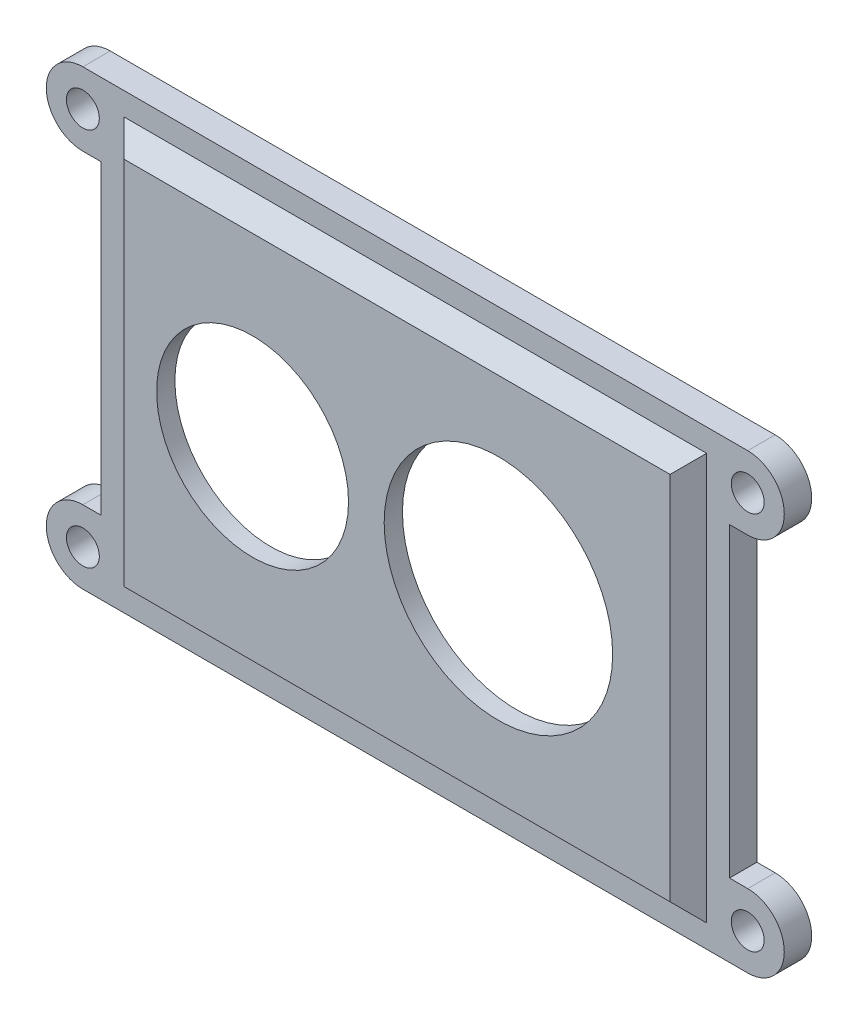
ISO-10303-21;
HEADER;
FILE_DESCRIPTION(('STEP AP214'),'2;1');
FILE_NAME('part.step','',(''),(''),'','','');
FILE_SCHEMA(('AUTOMOTIVE_DESIGN { 1 0 10303 214 1 1 1 1 }'));
ENDSEC;
DATA;
#1=APPLICATION_CONTEXT('core data for automotive mechanical design processes');
#2=APPLICATION_PROTOCOL_DEFINITION('international standard','automotive_design',2000,#1);
#3=PRODUCT_CONTEXT('',#1,'mechanical');
#4=PRODUCT('Part','Part','',(#3));
#5=PRODUCT_RELATED_PRODUCT_CATEGORY('part','',(#4));
#6=PRODUCT_DEFINITION_FORMATION('','',#4);
#7=PRODUCT_DEFINITION_CONTEXT('part definition',#1,'design');
#8=PRODUCT_DEFINITION('design','',#6,#7);
#9=PRODUCT_DEFINITION_SHAPE('','',#8);
#10=(LENGTH_UNIT() NAMED_UNIT(*) SI_UNIT(.MILLI.,.METRE.));
#11=(NAMED_UNIT(*) PLANE_ANGLE_UNIT() SI_UNIT($,.RADIAN.));
#12=(NAMED_UNIT(*) SI_UNIT($,.STERADIAN.) SOLID_ANGLE_UNIT());
#13=UNCERTAINTY_MEASURE_WITH_UNIT(LENGTH_MEASURE(1.E-05),#10,'distance_accuracy_value','');
#14=(GEOMETRIC_REPRESENTATION_CONTEXT(3) GLOBAL_UNCERTAINTY_ASSIGNED_CONTEXT((#13)) GLOBAL_UNIT_ASSIGNED_CONTEXT((#10,
#11,#12)) REPRESENTATION_CONTEXT('',''));
#15=CARTESIAN_POINT('',(0.,0.,0.));
#16=DIRECTION('',(0.,0.,1.));
#17=DIRECTION('',(1.,0.,0.));
#18=AXIS2_PLACEMENT_3D('',#15,#16,#17);
#19=CARTESIAN_POINT('',(-34.375,-24.75,5.));
#20=DIRECTION('',(1.,0.,0.));
#21=DIRECTION('',(0.,0.,-1.));
#22=AXIS2_PLACEMENT_3D('',#19,#20,#21);
#23=PLANE('',#22);
#24=DIRECTION('',(0.,0.,-1.));
#25=VECTOR('',#24,1.);
#26=CARTESIAN_POINT('',(-34.375,-16.75,3.));
#27=LINE('',#26,#25);
#28=CARTESIAN_POINT('',(-34.375,-16.75,3.));
#29=VERTEX_POINT('',#28);
#30=CARTESIAN_POINT('',(-34.375,-16.75,0.));
#31=VERTEX_POINT('',#30);
#32=EDGE_CURVE('E259',#29,#31,#27,.T.);
#33=ORIENTED_EDGE('',*,*,#32,.F.);
#34=DIRECTION('',(0.,1.,0.));
#35=VECTOR('',#34,1.);
#36=CARTESIAN_POINT('',(-34.375,0.,3.));
#37=LINE('',#36,#35);
#38=CARTESIAN_POINT('',(-34.375,16.75,3.));
#39=VERTEX_POINT('',#38);
#40=EDGE_CURVE('E217',#29,#39,#37,.T.);
#41=ORIENTED_EDGE('',*,*,#40,.T.);
#42=DIRECTION('',(0.,0.,-1.));
#43=VECTOR('',#42,1.);
#44=CARTESIAN_POINT('',(-34.375,16.75,3.));
#45=LINE('',#44,#43);
#46=CARTESIAN_POINT('',(-34.375,16.75,0.));
#47=VERTEX_POINT('',#46);
#48=EDGE_CURVE('E230',#39,#47,#45,.T.);
#49=ORIENTED_EDGE('',*,*,#48,.T.);
#50=DIRECTION('',(0.,-1.,0.));
#51=VECTOR('',#50,1.);
#52=CARTESIAN_POINT('',(-34.375,-24.75,0.));
#53=LINE('',#52,#51);
#54=EDGE_CURVE('E352',#47,#31,#53,.T.);
#55=ORIENTED_EDGE('',*,*,#54,.T.);
#56=EDGE_LOOP('',(#33,#41,#49,#55));
#57=FACE_BOUND('',#56,.T.);
#58=ADVANCED_FACE('F41',(#57),#23,.F.);
#59=CARTESIAN_POINT('',(34.375,-24.75,5.));
#60=DIRECTION('',(-1.,0.,0.));
#61=DIRECTION('',(0.,0.,1.));
#62=AXIS2_PLACEMENT_3D('',#59,#60,#61);
#63=PLANE('',#62);
#64=DIRECTION('',(0.,0.,-1.));
#65=VECTOR('',#64,1.);
#66=CARTESIAN_POINT('',(34.375,16.75,3.));
#67=LINE('',#66,#65);
#68=CARTESIAN_POINT('',(34.375,16.75,3.));
#69=VERTEX_POINT('',#68);
#70=CARTESIAN_POINT('',(34.375,16.75,0.));
#71=VERTEX_POINT('',#70);
#72=EDGE_CURVE('E328',#69,#71,#67,.T.);
#73=ORIENTED_EDGE('',*,*,#72,.F.);
#74=DIRECTION('',(0.,-1.,0.));
#75=VECTOR('',#74,1.);
#76=CARTESIAN_POINT('',(34.375,0.,3.));
#77=LINE('',#76,#75);
#78=CARTESIAN_POINT('',(34.375,-16.75,3.));
#79=VERTEX_POINT('',#78);
#80=EDGE_CURVE('E188',#69,#79,#77,.T.);
#81=ORIENTED_EDGE('',*,*,#80,.T.);
#82=DIRECTION('',(0.,0.,-1.));
#83=VECTOR('',#82,1.);
#84=CARTESIAN_POINT('',(34.375,-16.75,3.));
#85=LINE('',#84,#83);
#86=CARTESIAN_POINT('',(34.375,-16.75,0.));
#87=VERTEX_POINT('',#86);
#88=EDGE_CURVE('E220',#79,#87,#85,.T.);
#89=ORIENTED_EDGE('',*,*,#88,.T.);
#90=DIRECTION('',(0.,1.,0.));
#91=VECTOR('',#90,1.);
#92=CARTESIAN_POINT('',(34.375,-24.75,0.));
#93=LINE('',#92,#91);
#94=EDGE_CURVE('E362',#87,#71,#93,.T.);
#95=ORIENTED_EDGE('',*,*,#94,.T.);
#96=EDGE_LOOP('',(#73,#81,#89,#95));
#97=FACE_BOUND('',#96,.T.);
#98=ADVANCED_FACE('F388',(#97),#63,.F.);
#99=CARTESIAN_POINT('',(34.375,-24.75,5.));
#100=DIRECTION('',(0.,1.,0.));
#101=DIRECTION('',(-1.,0.,0.));
#102=AXIS2_PLACEMENT_3D('',#99,#100,#101);
#103=PLANE('',#102);
#104=DIRECTION('',(-1.,0.,0.));
#105=VECTOR('',#104,1.);
#106=CARTESIAN_POINT('',(36.375,-24.75,3.));
#107=LINE('',#106,#105);
#108=CARTESIAN_POINT('',(36.375,-24.75,3.));
#109=VERTEX_POINT('',#108);
#110=CARTESIAN_POINT('',(-36.375,-24.75,3.));
#111=VERTEX_POINT('',#110);
#112=EDGE_CURVE('E298',#109,#111,#107,.T.);
#113=ORIENTED_EDGE('',*,*,#112,.T.);
#114=DIRECTION('',(0.,0.,-1.));
#115=VECTOR('',#114,1.);
#116=CARTESIAN_POINT('',(-36.375,-24.75,3.));
#117=LINE('',#116,#115);
#118=CARTESIAN_POINT('',(-36.375,-24.75,0.));
#119=VERTEX_POINT('',#118);
#120=EDGE_CURVE('E258',#111,#119,#117,.T.);
#121=ORIENTED_EDGE('',*,*,#120,.T.);
#122=DIRECTION('',(1.,0.,0.));
#123=VECTOR('',#122,1.);
#124=CARTESIAN_POINT('',(34.375,-24.75,0.));
#125=LINE('',#124,#123);
#126=CARTESIAN_POINT('',(36.375,-24.75,0.));
#127=VERTEX_POINT('',#126);
#128=EDGE_CURVE('E361',#119,#127,#125,.T.);
#129=ORIENTED_EDGE('',*,*,#128,.T.);
#130=DIRECTION('',(0.,0.,-1.));
#131=VECTOR('',#130,1.);
#132=CARTESIAN_POINT('',(36.375,-24.75,3.));
#133=LINE('',#132,#131);
#134=EDGE_CURVE('E278',#109,#127,#133,.T.);
#135=ORIENTED_EDGE('',*,*,#134,.F.);
#136=EDGE_LOOP('',(#113,#121,#129,#135));
#137=FACE_BOUND('',#136,.T.);
#138=ADVANCED_FACE('F396',(#137),#103,.F.);
#139=CARTESIAN_POINT('',(34.375,24.75,5.));
#140=DIRECTION('',(0.,-1.,0.));
#141=DIRECTION('',(1.,0.,0.));
#142=AXIS2_PLACEMENT_3D('',#139,#140,#141);
#143=PLANE('',#142);
#144=DIRECTION('',(1.,0.,0.));
#145=VECTOR('',#144,1.);
#146=CARTESIAN_POINT('',(-36.375,24.75,3.));
#147=LINE('',#146,#145);
#148=CARTESIAN_POINT('',(-36.375,24.75,3.));
#149=VERTEX_POINT('',#148);
#150=CARTESIAN_POINT('',(36.375,24.75,3.));
#151=VERTEX_POINT('',#150);
#152=EDGE_CURVE('E244',#149,#151,#147,.T.);
#153=ORIENTED_EDGE('',*,*,#152,.T.);
#154=DIRECTION('',(0.,0.,-1.));
#155=VECTOR('',#154,1.);
#156=CARTESIAN_POINT('',(36.375,24.75,3.));
#157=LINE('',#156,#155);
#158=CARTESIAN_POINT('',(36.375,24.75,0.));
#159=VERTEX_POINT('',#158);
#160=EDGE_CURVE('E325',#151,#159,#157,.T.);
#161=ORIENTED_EDGE('',*,*,#160,.T.);
#162=DIRECTION('',(-1.,0.,0.));
#163=VECTOR('',#162,1.);
#164=CARTESIAN_POINT('',(34.375,24.75,0.));
#165=LINE('',#164,#163);
#166=CARTESIAN_POINT('',(-36.375,24.75,0.));
#167=VERTEX_POINT('',#166);
#168=EDGE_CURVE('E368',#159,#167,#165,.T.);
#169=ORIENTED_EDGE('',*,*,#168,.T.);
#170=DIRECTION('',(0.,0.,-1.));
#171=VECTOR('',#170,1.);
#172=CARTESIAN_POINT('',(-36.375,24.75,3.));
#173=LINE('',#172,#171);
#174=EDGE_CURVE('E224',#149,#167,#173,.T.);
#175=ORIENTED_EDGE('',*,*,#174,.F.);
#176=EDGE_LOOP('',(#153,#161,#169,#175));
#177=FACE_BOUND('',#176,.T.);
#178=ADVANCED_FACE('F466',(#177),#143,.F.);
#179=CARTESIAN_POINT('',(0.,0.,0.));
#180=DIRECTION('',(0.,0.,1.));
#181=DIRECTION('',(1.,0.,0.));
#182=AXIS2_PLACEMENT_3D('',#179,#180,#181);
#183=PLANE('',#182);
#184=DIRECTION('',(-1.,0.,0.));
#185=VECTOR('',#184,1.);
#186=CARTESIAN_POINT('',(-30.375,-20.5,0.));
#187=LINE('',#186,#185);
#188=CARTESIAN_POINT('',(30.375,-20.5,0.));
#189=VERTEX_POINT('',#188);
#190=CARTESIAN_POINT('',(-30.375,-20.5,0.));
#191=VERTEX_POINT('',#190);
#192=EDGE_CURVE('E341',#189,#191,#187,.T.);
#193=ORIENTED_EDGE('',*,*,#192,.F.);
#194=DIRECTION('',(0.,-1.,0.));
#195=VECTOR('',#194,1.);
#196=CARTESIAN_POINT('',(30.375,-20.5,0.));
#197=LINE('',#196,#195);
#198=CARTESIAN_POINT('',(30.375,20.5,0.));
#199=VERTEX_POINT('',#198);
#200=EDGE_CURVE('E323',#199,#189,#197,.T.);
#201=ORIENTED_EDGE('',*,*,#200,.F.);
#202=DIRECTION('',(1.,0.,0.));
#203=VECTOR('',#202,1.);
#204=CARTESIAN_POINT('',(-30.375,20.5,0.));
#205=LINE('',#204,#203);
#206=CARTESIAN_POINT('',(-30.375,20.5,0.));
#207=VERTEX_POINT('',#206);
#208=EDGE_CURVE('E333',#207,#199,#205,.T.);
#209=ORIENTED_EDGE('',*,*,#208,.F.);
#210=DIRECTION('',(0.,1.,0.));
#211=VECTOR('',#210,1.);
#212=CARTESIAN_POINT('',(-30.375,-20.5,0.));
#213=LINE('',#212,#211);
#214=EDGE_CURVE('E350',#191,#207,#213,.T.);
#215=ORIENTED_EDGE('',*,*,#214,.F.);
#216=EDGE_LOOP('',(#193,#201,#209,#215));
#217=FACE_BOUND('',#216,.T.);
#218=ORIENTED_EDGE('',*,*,#54,.F.);
#219=DIRECTION('',(-1.,0.,0.));
#220=VECTOR('',#219,1.);
#221=CARTESIAN_POINT('',(-34.375,16.75,0.));
#222=LINE('',#221,#220);
#223=CARTESIAN_POINT('',(-36.375,16.75,0.));
#224=VERTEX_POINT('',#223);
#225=EDGE_CURVE('E232',#47,#224,#222,.T.);
#226=ORIENTED_EDGE('',*,*,#225,.T.);
#227=CARTESIAN_POINT('',(-36.375,20.75,0.));
#228=DIRECTION('',(0.,0.,-1.));
#229=DIRECTION('',(1.,0.,0.));
#230=AXIS2_PLACEMENT_3D('',#227,#228,#229);
#231=CIRCLE('',#230,4.);
#232=EDGE_CURVE('E238',#224,#167,#231,.T.);
#233=ORIENTED_EDGE('',*,*,#232,.T.);
#234=ORIENTED_EDGE('',*,*,#168,.F.);
#235=CARTESIAN_POINT('',(36.375,20.75,0.));
#236=DIRECTION('',(0.,0.,-1.));
#237=DIRECTION('',(-1.,0.,0.));
#238=AXIS2_PLACEMENT_3D('',#235,#236,#237);
#239=CIRCLE('',#238,4.);
#240=CARTESIAN_POINT('',(36.375,16.75,0.));
#241=VERTEX_POINT('',#240);
#242=EDGE_CURVE('E310',#159,#241,#239,.T.);
#243=ORIENTED_EDGE('',*,*,#242,.T.);
#244=DIRECTION('',(-1.,0.,0.));
#245=VECTOR('',#244,1.);
#246=CARTESIAN_POINT('',(34.375,16.75,0.));
#247=LINE('',#246,#245);
#248=EDGE_CURVE('E313',#241,#71,#247,.T.);
#249=ORIENTED_EDGE('',*,*,#248,.T.);
#250=ORIENTED_EDGE('',*,*,#94,.F.);
#251=DIRECTION('',(1.,0.,0.));
#252=VECTOR('',#251,1.);
#253=CARTESIAN_POINT('',(34.375,-16.75,0.));
#254=LINE('',#253,#252);
#255=CARTESIAN_POINT('',(36.375,-16.75,0.));
#256=VERTEX_POINT('',#255);
#257=EDGE_CURVE('E286',#87,#256,#254,.T.);
#258=ORIENTED_EDGE('',*,*,#257,.T.);
#259=CARTESIAN_POINT('',(36.375,-20.75,0.));
#260=DIRECTION('',(0.,0.,-1.));
#261=DIRECTION('',(1.,0.,0.));
#262=AXIS2_PLACEMENT_3D('',#259,#260,#261);
#263=CIRCLE('',#262,4.);
#264=EDGE_CURVE('E287',#256,#127,#263,.T.);
#265=ORIENTED_EDGE('',*,*,#264,.T.);
#266=ORIENTED_EDGE('',*,*,#128,.F.);
#267=CARTESIAN_POINT('',(-36.375,-20.75,0.));
#268=DIRECTION('',(0.,0.,-1.));
#269=DIRECTION('',(-1.,0.,0.));
#270=AXIS2_PLACEMENT_3D('',#267,#268,#269);
#271=CIRCLE('',#270,4.);
#272=CARTESIAN_POINT('',(-36.375,-16.75,0.));
#273=VERTEX_POINT('',#272);
#274=EDGE_CURVE('E270',#119,#273,#271,.T.);
#275=ORIENTED_EDGE('',*,*,#274,.T.);
#276=DIRECTION('',(1.,0.,0.));
#277=VECTOR('',#276,1.);
#278=CARTESIAN_POINT('',(-34.375,-16.75,0.));
#279=LINE('',#278,#277);
#280=EDGE_CURVE('E262',#273,#31,#279,.T.);
#281=ORIENTED_EDGE('',*,*,#280,.T.);
#282=EDGE_LOOP('',(#218,#226,#233,#234,#243,#249,#250,#258,#265,#266,#275,#281));
#283=FACE_BOUND('',#282,.T.);
#284=CARTESIAN_POINT('',(36.375,20.75,0.));
#285=DIRECTION('',(0.,0.,-1.));
#286=DIRECTION('',(-1.,0.,0.));
#287=AXIS2_PLACEMENT_3D('',#284,#285,#286);
#288=CIRCLE('',#287,1.8);
#289=CARTESIAN_POINT('',(34.575,20.75,0.));
#290=VERTEX_POINT('',#289);
#291=EDGE_CURVE('E255',#290,#290,#288,.T.);
#292=ORIENTED_EDGE('',*,*,#291,.F.);
#293=EDGE_LOOP('',(#292));
#294=FACE_BOUND('',#293,.T.);
#295=CARTESIAN_POINT('',(36.375,-20.75,0.));
#296=DIRECTION('',(0.,0.,-1.));
#297=DIRECTION('',(1.,0.,0.));
#298=AXIS2_PLACEMENT_3D('',#295,#296,#297);
#299=CIRCLE('',#298,1.8);
#300=CARTESIAN_POINT('',(38.175,-20.75,0.));
#301=VERTEX_POINT('',#300);
#302=EDGE_CURVE('E261',#301,#301,#299,.T.);
#303=ORIENTED_EDGE('',*,*,#302,.F.);
#304=EDGE_LOOP('',(#303));
#305=FACE_BOUND('',#304,.T.);
#306=CARTESIAN_POINT('',(-36.375,20.75,0.));
#307=DIRECTION('',(0.,0.,-1.));
#308=DIRECTION('',(1.,0.,0.));
#309=AXIS2_PLACEMENT_3D('',#306,#307,#308);
#310=CIRCLE('',#309,1.8);
#311=CARTESIAN_POINT('',(-34.575,20.75,0.));
#312=VERTEX_POINT('',#311);
#313=EDGE_CURVE('E248',#312,#312,#310,.T.);
#314=ORIENTED_EDGE('',*,*,#313,.F.);
#315=EDGE_LOOP('',(#314));
#316=FACE_BOUND('',#315,.T.);
#317=CARTESIAN_POINT('',(-36.375,-20.75,0.));
#318=DIRECTION('',(0.,0.,-1.));
#319=DIRECTION('',(-1.,0.,0.));
#320=AXIS2_PLACEMENT_3D('',#317,#318,#319);
#321=CIRCLE('',#320,1.8);
#322=CARTESIAN_POINT('',(-38.175,-20.75,0.));
#323=VERTEX_POINT('',#322);
#324=EDGE_CURVE('E234',#323,#323,#321,.T.);
#325=ORIENTED_EDGE('',*,*,#324,.F.);
#326=EDGE_LOOP('',(#325));
#327=FACE_BOUND('',#326,.T.);
#328=ADVANCED_FACE('F485',(#217,#283,#294,#305,#316,#327),#183,.F.);
#329=CARTESIAN_POINT('',(30.375,-20.5,3.));
#330=DIRECTION('',(1.,0.,0.));
#331=DIRECTION('',(0.,0.,-1.));
#332=AXIS2_PLACEMENT_3D('',#329,#330,#331);
#333=PLANE('',#332);
#334=ORIENTED_EDGE('',*,*,#200,.T.);
#335=DIRECTION('',(0.,0.,-1.));
#336=VECTOR('',#335,1.);
#337=CARTESIAN_POINT('',(30.375,-20.5,3.));
#338=LINE('',#337,#336);
#339=CARTESIAN_POINT('',(30.375,-20.5,3.));
#340=VERTEX_POINT('',#339);
#341=EDGE_CURVE('E345',#340,#189,#338,.T.);
#342=ORIENTED_EDGE('',*,*,#341,.F.);
#343=DIRECTION('',(0.,-1.,0.));
#344=VECTOR('',#343,1.);
#345=CARTESIAN_POINT('',(30.375,-20.5,3.));
#346=LINE('',#345,#344);
#347=CARTESIAN_POINT('',(30.375,20.5,3.));
#348=VERTEX_POINT('',#347);
#349=EDGE_CURVE('E327',#348,#340,#346,.T.);
#350=ORIENTED_EDGE('',*,*,#349,.F.);
#351=DIRECTION('',(0.,0.,-1.));
#352=VECTOR('',#351,1.);
#353=CARTESIAN_POINT('',(30.375,20.5,3.));
#354=LINE('',#353,#352);
#355=EDGE_CURVE('E355',#348,#199,#354,.T.);
#356=ORIENTED_EDGE('',*,*,#355,.T.);
#357=EDGE_LOOP('',(#334,#342,#350,#356));
#358=FACE_BOUND('',#357,.T.);
#359=ADVANCED_FACE('F498',(#358),#333,.F.);
#360=CARTESIAN_POINT('',(-30.375,20.5,3.));
#361=DIRECTION('',(0.,1.,0.));
#362=DIRECTION('',(-1.,0.,0.));
#363=AXIS2_PLACEMENT_3D('',#360,#361,#362);
#364=PLANE('',#363);
#365=ORIENTED_EDGE('',*,*,#208,.T.);
#366=ORIENTED_EDGE('',*,*,#355,.F.);
#367=DIRECTION('',(1.,0.,0.));
#368=VECTOR('',#367,1.);
#369=CARTESIAN_POINT('',(-30.375,20.5,3.));
#370=LINE('',#369,#368);
#371=CARTESIAN_POINT('',(-30.375,20.5,3.));
#372=VERTEX_POINT('',#371);
#373=EDGE_CURVE('E339',#372,#348,#370,.T.);
#374=ORIENTED_EDGE('',*,*,#373,.F.);
#375=DIRECTION('',(0.,0.,-1.));
#376=VECTOR('',#375,1.);
#377=CARTESIAN_POINT('',(-30.375,20.5,3.));
#378=LINE('',#377,#376);
#379=EDGE_CURVE('E354',#372,#207,#378,.T.);
#380=ORIENTED_EDGE('',*,*,#379,.T.);
#381=EDGE_LOOP('',(#365,#366,#374,#380));
#382=FACE_BOUND('',#381,.T.);
#383=ADVANCED_FACE('F661',(#382),#364,.F.);
#384=CARTESIAN_POINT('',(-30.375,-20.5,3.));
#385=DIRECTION('',(-1.,0.,0.));
#386=DIRECTION('',(0.,0.,1.));
#387=AXIS2_PLACEMENT_3D('',#384,#385,#386);
#388=PLANE('',#387);
#389=ORIENTED_EDGE('',*,*,#214,.T.);
#390=ORIENTED_EDGE('',*,*,#379,.F.);
#391=DIRECTION('',(0.,1.,0.));
#392=VECTOR('',#391,1.);
#393=CARTESIAN_POINT('',(-30.375,-20.5,3.));
#394=LINE('',#393,#392);
#395=CARTESIAN_POINT('',(-30.375,-20.5,3.));
#396=VERTEX_POINT('',#395);
#397=EDGE_CURVE('E337',#396,#372,#394,.T.);
#398=ORIENTED_EDGE('',*,*,#397,.F.);
#399=DIRECTION('',(0.,0.,-1.));
#400=VECTOR('',#399,1.);
#401=CARTESIAN_POINT('',(-30.375,-20.5,3.));
#402=LINE('',#401,#400);
#403=EDGE_CURVE('E357',#396,#191,#402,.T.);
#404=ORIENTED_EDGE('',*,*,#403,.T.);
#405=EDGE_LOOP('',(#389,#390,#398,#404));
#406=FACE_BOUND('',#405,.T.);
#407=ADVANCED_FACE('F667',(#406),#388,.F.);
#408=CARTESIAN_POINT('',(-30.375,-20.5,3.));
#409=DIRECTION('',(0.,-1.,0.));
#410=DIRECTION('',(1.,0.,0.));
#411=AXIS2_PLACEMENT_3D('',#408,#409,#410);
#412=PLANE('',#411);
#413=ORIENTED_EDGE('',*,*,#192,.T.);
#414=ORIENTED_EDGE('',*,*,#403,.F.);
#415=DIRECTION('',(-1.,0.,0.));
#416=VECTOR('',#415,1.);
#417=CARTESIAN_POINT('',(-30.375,-20.5,3.));
#418=LINE('',#417,#416);
#419=EDGE_CURVE('E335',#340,#396,#418,.T.);
#420=ORIENTED_EDGE('',*,*,#419,.F.);
#421=ORIENTED_EDGE('',*,*,#341,.T.);
#422=EDGE_LOOP('',(#413,#414,#420,#421));
#423=FACE_BOUND('',#422,.T.);
#424=ADVANCED_FACE('F437',(#423),#412,.F.);
#425=CARTESIAN_POINT('',(0.,0.,3.));
#426=DIRECTION('',(0.,0.,-1.));
#427=DIRECTION('',(-1.,0.,0.));
#428=AXIS2_PLACEMENT_3D('',#425,#426,#427);
#429=PLANE('',#428);
#430=CARTESIAN_POINT('',(-15.80552942868,0.0500064159680687,3.));
#431=DIRECTION('',(0.,0.,-1.));
#432=DIRECTION('',(-1.,0.,0.));
#433=AXIS2_PLACEMENT_3D('',#430,#431,#432);
#434=CIRCLE('',#433,10.4999961179846);
#435=CARTESIAN_POINT('',(-26.3055255466646,0.0500064159680687,3.));
#436=VERTEX_POINT('',#435);
#437=EDGE_CURVE('E205',#436,#436,#434,.T.);
#438=ORIENTED_EDGE('',*,*,#437,.F.);
#439=EDGE_LOOP('',(#438));
#440=FACE_BOUND('',#439,.T.);
#441=CARTESIAN_POINT('',(11.0944715393175,0.0499982185605789,3.));
#442=DIRECTION('',(0.,0.,-1.));
#443=DIRECTION('',(-1.,0.,0.));
#444=AXIS2_PLACEMENT_3D('',#441,#442,#443);
#445=CIRCLE('',#444,12.499999063772);
#446=CARTESIAN_POINT('',(-1.40552752445456,0.0499982185605789,3.));
#447=VERTEX_POINT('',#446);
#448=EDGE_CURVE('E210',#447,#447,#445,.T.);
#449=ORIENTED_EDGE('',*,*,#448,.F.);
#450=EDGE_LOOP('',(#449));
#451=FACE_BOUND('',#450,.T.);
#452=ORIENTED_EDGE('',*,*,#349,.T.);
#453=ORIENTED_EDGE('',*,*,#419,.T.);
#454=ORIENTED_EDGE('',*,*,#397,.T.);
#455=ORIENTED_EDGE('',*,*,#373,.T.);
#456=EDGE_LOOP('',(#452,#453,#454,#455));
#457=FACE_BOUND('',#456,.T.);
#458=ADVANCED_FACE('F434',(#440,#451,#457),#429,.T.);
#459=CARTESIAN_POINT('',(36.375,20.75,3.));
#460=DIRECTION('',(0.,0.,-1.));
#461=DIRECTION('',(-1.,0.,0.));
#462=AXIS2_PLACEMENT_3D('',#459,#460,#461);
#463=CYLINDRICAL_SURFACE('',#462,4.);
#464=ORIENTED_EDGE('',*,*,#242,.F.);
#465=ORIENTED_EDGE('',*,*,#160,.F.);
#466=CARTESIAN_POINT('',(36.375,20.75,3.));
#467=DIRECTION('',(0.,0.,-1.));
#468=DIRECTION('',(-1.,0.,0.));
#469=AXIS2_PLACEMENT_3D('',#466,#467,#468);
#470=CIRCLE('',#469,4.);
#471=CARTESIAN_POINT('',(36.375,16.75,3.));
#472=VERTEX_POINT('',#471);
#473=EDGE_CURVE('E309',#151,#472,#470,.T.);
#474=ORIENTED_EDGE('',*,*,#473,.T.);
#475=DIRECTION('',(0.,0.,-1.));
#476=VECTOR('',#475,1.);
#477=CARTESIAN_POINT('',(36.375,16.75,3.));
#478=LINE('',#477,#476);
#479=EDGE_CURVE('E320',#472,#241,#478,.T.);
#480=ORIENTED_EDGE('',*,*,#479,.T.);
#481=EDGE_LOOP('',(#464,#465,#474,#480));
#482=FACE_BOUND('',#481,.T.);
#483=ADVANCED_FACE('F438',(#482),#463,.T.);
#484=CARTESIAN_POINT('',(34.375,16.75,3.));
#485=DIRECTION('',(0.,-1.,0.));
#486=DIRECTION('',(1.,0.,0.));
#487=AXIS2_PLACEMENT_3D('',#484,#485,#486);
#488=PLANE('',#487);
#489=ORIENTED_EDGE('',*,*,#248,.F.);
#490=ORIENTED_EDGE('',*,*,#479,.F.);
#491=DIRECTION('',(-1.,0.,0.));
#492=VECTOR('',#491,1.);
#493=CARTESIAN_POINT('',(34.375,16.75,3.));
#494=LINE('',#493,#492);
#495=EDGE_CURVE('E312',#472,#69,#494,.T.);
#496=ORIENTED_EDGE('',*,*,#495,.T.);
#497=ORIENTED_EDGE('',*,*,#72,.T.);
#498=EDGE_LOOP('',(#489,#490,#496,#497));
#499=FACE_BOUND('',#498,.T.);
#500=ADVANCED_FACE('F519',(#499),#488,.T.);
#501=CARTESIAN_POINT('',(36.375,20.75,3.));
#502=DIRECTION('',(0.,0.,-1.));
#503=DIRECTION('',(-1.,0.,0.));
#504=AXIS2_PLACEMENT_3D('',#501,#502,#503);
#505=CYLINDRICAL_SURFACE('',#504,1.8);
#506=CARTESIAN_POINT('',(36.375,20.75,3.));
#507=DIRECTION('',(0.,0.,-1.));
#508=DIRECTION('',(-1.,0.,0.));
#509=AXIS2_PLACEMENT_3D('',#506,#507,#508);
#510=CIRCLE('',#509,1.8);
#511=CARTESIAN_POINT('',(34.575,20.75,3.));
#512=VERTEX_POINT('',#511);
#513=EDGE_CURVE('E302',#512,#512,#510,.T.);
#514=ORIENTED_EDGE('',*,*,#513,.F.);
#515=EDGE_LOOP('',(#514));
#516=FACE_BOUND('',#515,.T.);
#517=ORIENTED_EDGE('',*,*,#291,.T.);
#518=EDGE_LOOP('',(#517));
#519=FACE_BOUND('',#518,.T.);
#520=ADVANCED_FACE('F528',(#516,#519),#505,.F.);
#521=CARTESIAN_POINT('',(36.375,-20.75,3.));
#522=DIRECTION('',(0.,0.,-1.));
#523=DIRECTION('',(-1.,0.,0.));
#524=AXIS2_PLACEMENT_3D('',#521,#522,#523);
#525=CYLINDRICAL_SURFACE('',#524,4.);
#526=ORIENTED_EDGE('',*,*,#264,.F.);
#527=DIRECTION('',(0.,0.,-1.));
#528=VECTOR('',#527,1.);
#529=CARTESIAN_POINT('',(36.375,-16.75,3.));
#530=LINE('',#529,#528);
#531=CARTESIAN_POINT('',(36.375,-16.75,3.));
#532=VERTEX_POINT('',#531);
#533=EDGE_CURVE('E213',#532,#256,#530,.T.);
#534=ORIENTED_EDGE('',*,*,#533,.F.);
#535=CARTESIAN_POINT('',(36.375,-20.75,3.));
#536=DIRECTION('',(0.,0.,-1.));
#537=DIRECTION('',(1.,0.,0.));
#538=AXIS2_PLACEMENT_3D('',#535,#536,#537);
#539=CIRCLE('',#538,4.);
#540=EDGE_CURVE('E289',#532,#109,#539,.T.);
#541=ORIENTED_EDGE('',*,*,#540,.T.);
#542=ORIENTED_EDGE('',*,*,#134,.T.);
#543=EDGE_LOOP('',(#526,#534,#541,#542));
#544=FACE_BOUND('',#543,.T.);
#545=ADVANCED_FACE('F539',(#544),#525,.T.);
#546=CARTESIAN_POINT('',(34.375,-16.75,3.));
#547=DIRECTION('',(0.,1.,0.));
#548=DIRECTION('',(-1.,0.,0.));
#549=AXIS2_PLACEMENT_3D('',#546,#547,#548);
#550=PLANE('',#549);
#551=ORIENTED_EDGE('',*,*,#257,.F.);
#552=ORIENTED_EDGE('',*,*,#88,.F.);
#553=DIRECTION('',(1.,0.,0.));
#554=VECTOR('',#553,1.);
#555=CARTESIAN_POINT('',(34.375,-16.75,3.));
#556=LINE('',#555,#554);
#557=EDGE_CURVE('E281',#79,#532,#556,.T.);
#558=ORIENTED_EDGE('',*,*,#557,.T.);
#559=ORIENTED_EDGE('',*,*,#533,.T.);
#560=EDGE_LOOP('',(#551,#552,#558,#559));
#561=FACE_BOUND('',#560,.T.);
#562=ADVANCED_FACE('F548',(#561),#550,.T.);
#563=CARTESIAN_POINT('',(36.375,-20.75,3.));
#564=DIRECTION('',(0.,0.,1.));
#565=DIRECTION('',(1.,0.,0.));
#566=AXIS2_PLACEMENT_3D('',#563,#564,#565);
#567=PLANE('',#566);
#568=CARTESIAN_POINT('',(36.375,-20.75,3.));
#569=DIRECTION('',(0.,0.,-1.));
#570=DIRECTION('',(1.,0.,0.));
#571=AXIS2_PLACEMENT_3D('',#568,#569,#570);
#572=CIRCLE('',#571,1.8);
#573=CARTESIAN_POINT('',(38.175,-20.75,3.));
#574=VERTEX_POINT('',#573);
#575=EDGE_CURVE('E291',#574,#574,#572,.T.);
#576=ORIENTED_EDGE('',*,*,#575,.T.);
#577=EDGE_LOOP('',(#576));
#578=FACE_BOUND('',#577,.T.);
#579=ORIENTED_EDGE('',*,*,#540,.F.);
#580=ORIENTED_EDGE('',*,*,#557,.F.);
#581=ORIENTED_EDGE('',*,*,#80,.F.);
#582=ORIENTED_EDGE('',*,*,#495,.F.);
#583=ORIENTED_EDGE('',*,*,#473,.F.);
#584=ORIENTED_EDGE('',*,*,#152,.F.);
#585=CARTESIAN_POINT('',(-36.375,20.75,3.));
#586=DIRECTION('',(0.,0.,-1.));
#587=DIRECTION('',(1.,0.,0.));
#588=AXIS2_PLACEMENT_3D('',#585,#586,#587);
#589=CIRCLE('',#588,4.);
#590=CARTESIAN_POINT('',(-36.375,16.75,3.));
#591=VERTEX_POINT('',#590);
#592=EDGE_CURVE('E237',#591,#149,#589,.T.);
#593=ORIENTED_EDGE('',*,*,#592,.F.);
#594=DIRECTION('',(-1.,0.,0.));
#595=VECTOR('',#594,1.);
#596=CARTESIAN_POINT('',(-34.375,16.75,3.));
#597=LINE('',#596,#595);
#598=EDGE_CURVE('E226',#39,#591,#597,.T.);
#599=ORIENTED_EDGE('',*,*,#598,.F.);
#600=ORIENTED_EDGE('',*,*,#40,.F.);
#601=DIRECTION('',(1.,0.,0.));
#602=VECTOR('',#601,1.);
#603=CARTESIAN_POINT('',(-34.375,-16.75,3.));
#604=LINE('',#603,#602);
#605=CARTESIAN_POINT('',(-36.375,-16.75,3.));
#606=VERTEX_POINT('',#605);
#607=EDGE_CURVE('E260',#606,#29,#604,.T.);
#608=ORIENTED_EDGE('',*,*,#607,.F.);
#609=CARTESIAN_POINT('',(-36.375,-20.75,3.));
#610=DIRECTION('',(0.,0.,-1.));
#611=DIRECTION('',(-1.,0.,0.));
#612=AXIS2_PLACEMENT_3D('',#609,#610,#611);
#613=CIRCLE('',#612,4.);
#614=EDGE_CURVE('E268',#111,#606,#613,.T.);
#615=ORIENTED_EDGE('',*,*,#614,.F.);
#616=ORIENTED_EDGE('',*,*,#112,.F.);
#617=EDGE_LOOP('',(#579,#580,#581,#582,#583,#584,#593,#599,#600,#608,#615,#616));
#618=FACE_BOUND('',#617,.T.);
#619=DIRECTION('',(1.,0.,0.));
#620=VECTOR('',#619,1.);
#621=CARTESIAN_POINT('',(0.,-22.25,3.));
#622=LINE('',#621,#620);
#623=CARTESIAN_POINT('',(-31.875,-22.25,3.));
#624=VERTEX_POINT('',#623);
#625=CARTESIAN_POINT('',(31.875,-22.25,3.));
#626=VERTEX_POINT('',#625);
#627=EDGE_CURVE('E214',#624,#626,#622,.T.);
#628=ORIENTED_EDGE('',*,*,#627,.F.);
#629=DIRECTION('',(0.,-1.,0.));
#630=VECTOR('',#629,1.);
#631=CARTESIAN_POINT('',(-31.875,0.,3.));
#632=LINE('',#631,#630);
#633=CARTESIAN_POINT('',(-31.875,22.25,3.));
#634=VERTEX_POINT('',#633);
#635=EDGE_CURVE('E184',#634,#624,#632,.T.);
#636=ORIENTED_EDGE('',*,*,#635,.F.);
#637=DIRECTION('',(1.,0.,0.));
#638=VECTOR('',#637,1.);
#639=CARTESIAN_POINT('',(0.,22.25,3.));
#640=LINE('',#639,#638);
#641=CARTESIAN_POINT('',(31.875,22.25,3.));
#642=VERTEX_POINT('',#641);
#643=EDGE_CURVE('E177',#634,#642,#640,.T.);
#644=ORIENTED_EDGE('',*,*,#643,.T.);
#645=DIRECTION('',(0.,-1.,0.));
#646=VECTOR('',#645,1.);
#647=CARTESIAN_POINT('',(31.875,0.,3.));
#648=LINE('',#647,#646);
#649=EDGE_CURVE('E182',#642,#626,#648,.T.);
#650=ORIENTED_EDGE('',*,*,#649,.T.);
#651=EDGE_LOOP('',(#628,#636,#644,#650));
#652=FACE_BOUND('',#651,.T.);
#653=ORIENTED_EDGE('',*,*,#513,.T.);
#654=EDGE_LOOP('',(#653));
#655=FACE_BOUND('',#654,.T.);
#656=CARTESIAN_POINT('',(-36.375,20.75,3.));
#657=DIRECTION('',(0.,0.,-1.));
#658=DIRECTION('',(1.,0.,0.));
#659=AXIS2_PLACEMENT_3D('',#656,#657,#658);
#660=CIRCLE('',#659,1.8);
#661=CARTESIAN_POINT('',(-34.575,20.75,3.));
#662=VERTEX_POINT('',#661);
#663=EDGE_CURVE('E245',#662,#662,#660,.T.);
#664=ORIENTED_EDGE('',*,*,#663,.T.);
#665=EDGE_LOOP('',(#664));
#666=FACE_BOUND('',#665,.T.);
#667=CARTESIAN_POINT('',(-36.375,-20.75,3.));
#668=DIRECTION('',(0.,0.,-1.));
#669=DIRECTION('',(-1.,0.,0.));
#670=AXIS2_PLACEMENT_3D('',#667,#668,#669);
#671=CIRCLE('',#670,1.8);
#672=CARTESIAN_POINT('',(-38.175,-20.75,3.));
#673=VERTEX_POINT('',#672);
#674=EDGE_CURVE('E272',#673,#673,#671,.T.);
#675=ORIENTED_EDGE('',*,*,#674,.T.);
#676=EDGE_LOOP('',(#675));
#677=FACE_BOUND('',#676,.T.);
#678=ADVANCED_FACE('F181',(#578,#618,#652,#655,#666,#677),#567,.T.);
#679=CARTESIAN_POINT('',(36.375,-20.75,3.));
#680=DIRECTION('',(0.,0.,-1.));
#681=DIRECTION('',(-1.,0.,0.));
#682=AXIS2_PLACEMENT_3D('',#679,#680,#681);
#683=CYLINDRICAL_SURFACE('',#682,1.8);
#684=ORIENTED_EDGE('',*,*,#575,.F.);
#685=EDGE_LOOP('',(#684));
#686=FACE_BOUND('',#685,.T.);
#687=ORIENTED_EDGE('',*,*,#302,.T.);
#688=EDGE_LOOP('',(#687));
#689=FACE_BOUND('',#688,.T.);
#690=ADVANCED_FACE('F568',(#686,#689),#683,.F.);
#691=CARTESIAN_POINT('',(-36.375,20.75,3.));
#692=DIRECTION('',(0.,0.,-1.));
#693=DIRECTION('',(-1.,0.,0.));
#694=AXIS2_PLACEMENT_3D('',#691,#692,#693);
#695=CYLINDRICAL_SURFACE('',#694,4.);
#696=ORIENTED_EDGE('',*,*,#232,.F.);
#697=DIRECTION('',(0.,0.,-1.));
#698=VECTOR('',#697,1.);
#699=CARTESIAN_POINT('',(-36.375,16.75,3.));
#700=LINE('',#699,#698);
#701=EDGE_CURVE('E235',#591,#224,#700,.T.);
#702=ORIENTED_EDGE('',*,*,#701,.F.);
#703=ORIENTED_EDGE('',*,*,#592,.T.);
#704=ORIENTED_EDGE('',*,*,#174,.T.);
#705=EDGE_LOOP('',(#696,#702,#703,#704));
#706=FACE_BOUND('',#705,.T.);
#707=ADVANCED_FACE('F578',(#706),#695,.T.);
#708=CARTESIAN_POINT('',(-34.375,16.75,3.));
#709=DIRECTION('',(0.,-1.,0.));
#710=DIRECTION('',(1.,0.,0.));
#711=AXIS2_PLACEMENT_3D('',#708,#709,#710);
#712=PLANE('',#711);
#713=ORIENTED_EDGE('',*,*,#225,.F.);
#714=ORIENTED_EDGE('',*,*,#48,.F.);
#715=ORIENTED_EDGE('',*,*,#598,.T.);
#716=ORIENTED_EDGE('',*,*,#701,.T.);
#717=EDGE_LOOP('',(#713,#714,#715,#716));
#718=FACE_BOUND('',#717,.T.);
#719=ADVANCED_FACE('F589',(#718),#712,.T.);
#720=CARTESIAN_POINT('',(-36.375,20.75,3.));
#721=DIRECTION('',(0.,0.,-1.));
#722=DIRECTION('',(-1.,0.,0.));
#723=AXIS2_PLACEMENT_3D('',#720,#721,#722);
#724=CYLINDRICAL_SURFACE('',#723,1.8);
#725=ORIENTED_EDGE('',*,*,#663,.F.);
#726=EDGE_LOOP('',(#725));
#727=FACE_BOUND('',#726,.T.);
#728=ORIENTED_EDGE('',*,*,#313,.T.);
#729=EDGE_LOOP('',(#728));
#730=FACE_BOUND('',#729,.T.);
#731=ADVANCED_FACE('F598',(#727,#730),#724,.F.);
#732=CARTESIAN_POINT('',(-36.375,-20.75,3.));
#733=DIRECTION('',(0.,0.,-1.));
#734=DIRECTION('',(-1.,0.,0.));
#735=AXIS2_PLACEMENT_3D('',#732,#733,#734);
#736=CYLINDRICAL_SURFACE('',#735,4.);
#737=ORIENTED_EDGE('',*,*,#274,.F.);
#738=ORIENTED_EDGE('',*,*,#120,.F.);
#739=ORIENTED_EDGE('',*,*,#614,.T.);
#740=DIRECTION('',(0.,0.,-1.));
#741=VECTOR('',#740,1.);
#742=CARTESIAN_POINT('',(-36.375,-16.75,3.));
#743=LINE('',#742,#741);
#744=EDGE_CURVE('E253',#606,#273,#743,.T.);
#745=ORIENTED_EDGE('',*,*,#744,.T.);
#746=EDGE_LOOP('',(#737,#738,#739,#745));
#747=FACE_BOUND('',#746,.T.);
#748=ADVANCED_FACE('F609',(#747),#736,.T.);
#749=CARTESIAN_POINT('',(-34.375,-16.75,3.));
#750=DIRECTION('',(0.,1.,0.));
#751=DIRECTION('',(-1.,0.,0.));
#752=AXIS2_PLACEMENT_3D('',#749,#750,#751);
#753=PLANE('',#752);
#754=ORIENTED_EDGE('',*,*,#280,.F.);
#755=ORIENTED_EDGE('',*,*,#744,.F.);
#756=ORIENTED_EDGE('',*,*,#607,.T.);
#757=ORIENTED_EDGE('',*,*,#32,.T.);
#758=EDGE_LOOP('',(#754,#755,#756,#757));
#759=FACE_BOUND('',#758,.T.);
#760=ADVANCED_FACE('F385',(#759),#753,.T.);
#761=CARTESIAN_POINT('',(-36.375,-20.75,3.));
#762=DIRECTION('',(0.,0.,-1.));
#763=DIRECTION('',(-1.,0.,0.));
#764=AXIS2_PLACEMENT_3D('',#761,#762,#763);
#765=CYLINDRICAL_SURFACE('',#764,1.8);
#766=ORIENTED_EDGE('',*,*,#674,.F.);
#767=EDGE_LOOP('',(#766));
#768=FACE_BOUND('',#767,.T.);
#769=ORIENTED_EDGE('',*,*,#324,.T.);
#770=EDGE_LOOP('',(#769));
#771=FACE_BOUND('',#770,.T.);
#772=ADVANCED_FACE('F373',(#768,#771),#765,.F.);
#773=CARTESIAN_POINT('',(0.,0.,5.));
#774=DIRECTION('',(0.,0.,1.));
#775=DIRECTION('',(1.,0.,0.));
#776=AXIS2_PLACEMENT_3D('',#773,#774,#775);
#777=PLANE('',#776);
#778=CARTESIAN_POINT('',(-15.80552942868,0.0500064159680687,5.));
#779=DIRECTION('',(0.,0.,1.));
#780=DIRECTION('',(1.,0.,0.));
#781=AXIS2_PLACEMENT_3D('',#778,#779,#780);
#782=CIRCLE('',#781,10.4999961179846);
#783=CARTESIAN_POINT('',(-5.30553331069537,0.0500064159680687,5.));
#784=VERTEX_POINT('',#783);
#785=EDGE_CURVE('E747',#784,#784,#782,.T.);
#786=ORIENTED_EDGE('',*,*,#785,.F.);
#787=EDGE_LOOP('',(#786));
#788=FACE_BOUND('',#787,.T.);
#789=CARTESIAN_POINT('',(11.0944715393175,0.0499982185605789,5.));
#790=DIRECTION('',(0.,0.,1.));
#791=DIRECTION('',(1.,0.,0.));
#792=AXIS2_PLACEMENT_3D('',#789,#790,#791);
#793=CIRCLE('',#792,12.499999063772);
#794=CARTESIAN_POINT('',(23.5944706030895,0.0499982185605789,5.));
#795=VERTEX_POINT('',#794);
#796=EDGE_CURVE('E746',#795,#795,#793,.T.);
#797=ORIENTED_EDGE('',*,*,#796,.F.);
#798=EDGE_LOOP('',(#797));
#799=FACE_BOUND('',#798,.T.);
#800=DIRECTION('',(1.,0.,0.));
#801=VECTOR('',#800,1.);
#802=CARTESIAN_POINT('',(31.875,-20.25,5.));
#803=LINE('',#802,#801);
#804=CARTESIAN_POINT('',(-29.875,-20.25,5.));
#805=VERTEX_POINT('',#804);
#806=CARTESIAN_POINT('',(29.875,-20.25,5.));
#807=VERTEX_POINT('',#806);
#808=EDGE_CURVE('E51',#805,#807,#803,.T.);
#809=ORIENTED_EDGE('',*,*,#808,.T.);
#810=DIRECTION('',(0.,1.,0.));
#811=VECTOR('',#810,1.);
#812=CARTESIAN_POINT('',(29.875,0.,5.));
#813=LINE('',#812,#811);
#814=CARTESIAN_POINT('',(29.875,20.25,5.));
#815=VERTEX_POINT('',#814);
#816=EDGE_CURVE('E11',#807,#815,#813,.T.);
#817=ORIENTED_EDGE('',*,*,#816,.T.);
#818=DIRECTION('',(-1.,0.,0.));
#819=VECTOR('',#818,1.);
#820=CARTESIAN_POINT('',(0.,20.25,5.));
#821=LINE('',#820,#819);
#822=CARTESIAN_POINT('',(-29.875,20.25,5.));
#823=VERTEX_POINT('',#822);
#824=EDGE_CURVE('E201',#815,#823,#821,.T.);
#825=ORIENTED_EDGE('',*,*,#824,.T.);
#826=DIRECTION('',(0.,-1.,0.));
#827=VECTOR('',#826,1.);
#828=CARTESIAN_POINT('',(-29.875,-22.25,5.));
#829=LINE('',#828,#827);
#830=EDGE_CURVE('E65',#823,#805,#829,.T.);
#831=ORIENTED_EDGE('',*,*,#830,.T.);
#832=EDGE_LOOP('',(#809,#817,#825,#831));
#833=FACE_BOUND('',#832,.T.);
#834=ADVANCED_FACE('F371',(#788,#799,#833),#777,.T.);
#835=CARTESIAN_POINT('',(-31.875,0.,3.));
#836=DIRECTION('',(-0.707106781186549,0.,0.707106781186546));
#837=DIRECTION('',(0.,-1.,0.));
#838=AXIS2_PLACEMENT_3D('',#835,#836,#837);
#839=PLANE('',#838);
#840=DIRECTION('',(-0.577350269189625,0.577350269189625,-0.577350269189628));
#841=VECTOR('',#840,1.);
#842=CARTESIAN_POINT('',(-19.9166666666667,10.2916666666667,14.9583333333334));
#843=LINE('',#842,#841);
#844=EDGE_CURVE('E202',#634,#823,#843,.F.);
#845=ORIENTED_EDGE('',*,*,#844,.F.);
#846=ORIENTED_EDGE('',*,*,#635,.T.);
#847=DIRECTION('',(0.577350269189625,0.577350269189625,0.577350269189628));
#848=VECTOR('',#847,1.);
#849=CARTESIAN_POINT('',(-24.4583333333334,-14.8333333333333,10.4166666666667));
#850=LINE('',#849,#848);
#851=EDGE_CURVE('E46',#805,#624,#850,.F.);
#852=ORIENTED_EDGE('',*,*,#851,.F.);
#853=ORIENTED_EDGE('',*,*,#830,.F.);
#854=EDGE_LOOP('',(#845,#846,#852,#853));
#855=FACE_BOUND('',#854,.T.);
#856=ADVANCED_FACE('F42',(#855),#839,.T.);
#857=CARTESIAN_POINT('',(0.,-22.25,3.));
#858=DIRECTION('',(0.,-0.707106781186549,0.707106781186546));
#859=DIRECTION('',(1.,0.,0.));
#860=AXIS2_PLACEMENT_3D('',#857,#858,#859);
#861=PLANE('',#860);
#862=ORIENTED_EDGE('',*,*,#851,.T.);
#863=ORIENTED_EDGE('',*,*,#627,.T.);
#864=DIRECTION('',(0.577350269189625,-0.577350269189625,-0.577350269189628));
#865=VECTOR('',#864,1.);
#866=CARTESIAN_POINT('',(21.25,-11.625,13.625));
#867=LINE('',#866,#865);
#868=EDGE_CURVE('E200',#807,#626,#867,.T.);
#869=ORIENTED_EDGE('',*,*,#868,.F.);
#870=ORIENTED_EDGE('',*,*,#808,.F.);
#871=EDGE_LOOP('',(#862,#863,#869,#870));
#872=FACE_BOUND('',#871,.T.);
#873=ADVANCED_FACE('F215',(#872),#861,.T.);
#874=CARTESIAN_POINT('',(0.,20.25,5.));
#875=DIRECTION('',(0.,-0.707106781186549,-0.707106781186546));
#876=DIRECTION('',(-1.,0.,0.));
#877=AXIS2_PLACEMENT_3D('',#874,#875,#876);
#878=PLANE('',#877);
#879=ORIENTED_EDGE('',*,*,#844,.T.);
#880=ORIENTED_EDGE('',*,*,#824,.F.);
#881=DIRECTION('',(0.577350269189625,0.577350269189625,-0.577350269189628));
#882=VECTOR('',#881,1.);
#883=CARTESIAN_POINT('',(19.9166666666667,10.2916666666667,14.9583333333334));
#884=LINE('',#883,#882);
#885=EDGE_CURVE('E193',#642,#815,#884,.F.);
#886=ORIENTED_EDGE('',*,*,#885,.F.);
#887=ORIENTED_EDGE('',*,*,#643,.F.);
#888=EDGE_LOOP('',(#879,#880,#886,#887));
#889=FACE_BOUND('',#888,.T.);
#890=ADVANCED_FACE('F199',(#889),#878,.F.);
#891=CARTESIAN_POINT('',(29.875,0.,5.));
#892=DIRECTION('',(-0.707106781186549,0.,-0.707106781186546));
#893=DIRECTION('',(0.,1.,0.));
#894=AXIS2_PLACEMENT_3D('',#891,#892,#893);
#895=PLANE('',#894);
#896=ORIENTED_EDGE('',*,*,#868,.T.);
#897=ORIENTED_EDGE('',*,*,#649,.F.);
#898=ORIENTED_EDGE('',*,*,#885,.T.);
#899=ORIENTED_EDGE('',*,*,#816,.F.);
#900=EDGE_LOOP('',(#896,#897,#898,#899));
#901=FACE_BOUND('',#900,.T.);
#902=ADVANCED_FACE('F194',(#901),#895,.F.);
#903=CARTESIAN_POINT('',(11.0944715393175,0.0499982185605789,0.));
#904=DIRECTION('',(0.,0.,1.));
#905=DIRECTION('',(1.,0.,0.));
#906=AXIS2_PLACEMENT_3D('',#903,#904,#905);
#907=CYLINDRICAL_SURFACE('',#906,12.499999063772);
#908=ORIENTED_EDGE('',*,*,#448,.T.);
#909=EDGE_LOOP('',(#908));
#910=FACE_BOUND('',#909,.T.);
#911=ORIENTED_EDGE('',*,*,#796,.T.);
#912=EDGE_LOOP('',(#911));
#913=FACE_BOUND('',#912,.T.);
#914=ADVANCED_FACE('F409',(#910,#913),#907,.F.);
#915=CARTESIAN_POINT('',(-15.80552942868,0.0500064159680687,0.));
#916=DIRECTION('',(0.,0.,1.));
#917=DIRECTION('',(1.,0.,0.));
#918=AXIS2_PLACEMENT_3D('',#915,#916,#917);
#919=CYLINDRICAL_SURFACE('',#918,10.4999961179846);
#920=ORIENTED_EDGE('',*,*,#437,.T.);
#921=EDGE_LOOP('',(#920));
#922=FACE_BOUND('',#921,.T.);
#923=ORIENTED_EDGE('',*,*,#785,.T.);
#924=EDGE_LOOP('',(#923));
#925=FACE_BOUND('',#924,.T.);
#926=ADVANCED_FACE('F650',(#922,#925),#919,.F.);
#927=CLOSED_SHELL('',(#58,#98,#138,#178,#328,#359,#383,#407,#424,#458,#483,#500,#520,#545,#562,
#678,#690,#707,#719,#731,#748,#760,#772,#834,#856,#873,#890,#902,#914,#926));
#928=MANIFOLD_SOLID_BREP('B2',#927);
#929=ADVANCED_BREP_SHAPE_REPRESENTATION('',(#18,#928),#14);
#930=SHAPE_DEFINITION_REPRESENTATION(#9,#929);
ENDSEC;
END-ISO-10303-21;
